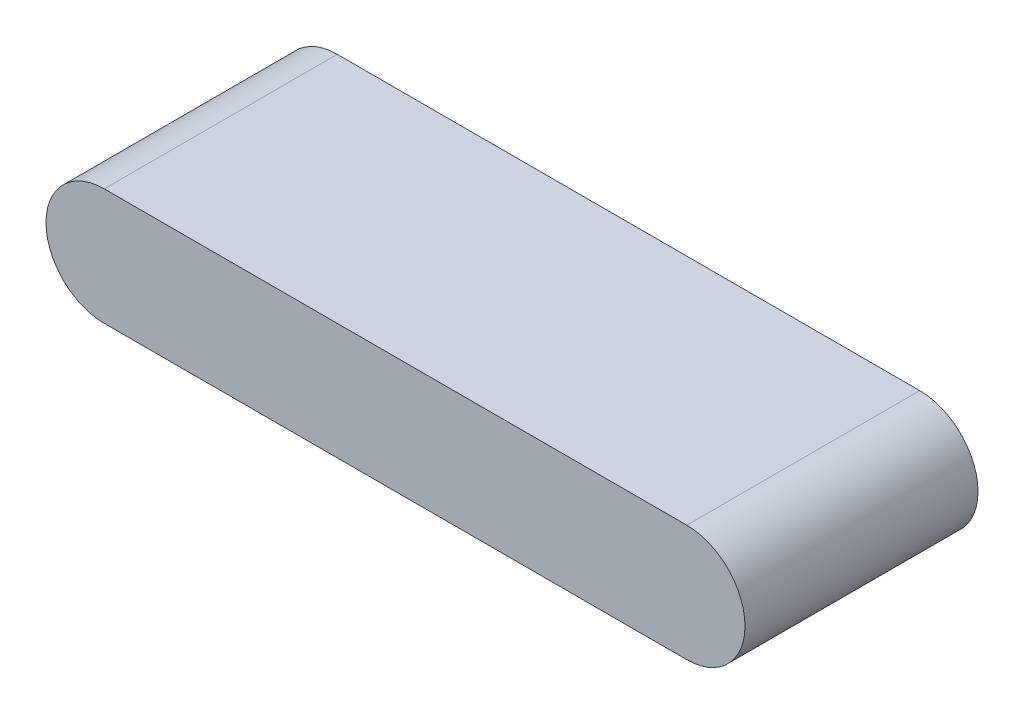
ISO-10303-21;
HEADER;
FILE_DESCRIPTION(('STEP AP214'),'2;1');
FILE_NAME('part.step','',(''),(''),'','','');
FILE_SCHEMA(('AUTOMOTIVE_DESIGN { 1 0 10303 214 1 1 1 1 }'));
ENDSEC;
DATA;
#1=APPLICATION_CONTEXT('core data for automotive mechanical design processes');
#2=APPLICATION_PROTOCOL_DEFINITION('international standard','automotive_design',2000,#1);
#3=PRODUCT_CONTEXT('',#1,'mechanical');
#4=PRODUCT('Part','Part','',(#3));
#5=PRODUCT_RELATED_PRODUCT_CATEGORY('part','',(#4));
#6=PRODUCT_DEFINITION_FORMATION('','',#4);
#7=PRODUCT_DEFINITION_CONTEXT('part definition',#1,'design');
#8=PRODUCT_DEFINITION('design','',#6,#7);
#9=PRODUCT_DEFINITION_SHAPE('','',#8);
#10=(LENGTH_UNIT() NAMED_UNIT(*) SI_UNIT(.MILLI.,.METRE.));
#11=(NAMED_UNIT(*) PLANE_ANGLE_UNIT() SI_UNIT($,.RADIAN.));
#12=(NAMED_UNIT(*) SI_UNIT($,.STERADIAN.) SOLID_ANGLE_UNIT());
#13=UNCERTAINTY_MEASURE_WITH_UNIT(LENGTH_MEASURE(1.E-05),#10,'distance_accuracy_value','');
#14=(GEOMETRIC_REPRESENTATION_CONTEXT(3) GLOBAL_UNCERTAINTY_ASSIGNED_CONTEXT((#13)) GLOBAL_UNIT_ASSIGNED_CONTEXT((#10,
#11,#12)) REPRESENTATION_CONTEXT('',''));
#15=CARTESIAN_POINT('',(0.,0.,0.));
#16=DIRECTION('',(0.,0.,1.));
#17=DIRECTION('',(1.,0.,0.));
#18=AXIS2_PLACEMENT_3D('',#15,#16,#17);
#19=CARTESIAN_POINT('',(-53.7983081875382,0.,25.4));
#20=DIRECTION('',(0.,0.,-1.));
#21=DIRECTION('',(-1.,0.,0.));
#22=AXIS2_PLACEMENT_3D('',#19,#20,#21);
#23=CYLINDRICAL_SURFACE('',#22,12.7);
#24=CARTESIAN_POINT('',(-53.7983081875382,0.,-25.4));
#25=DIRECTION('',(0.,0.,1.));
#26=DIRECTION('',(1.,0.,0.));
#27=AXIS2_PLACEMENT_3D('',#24,#25,#26);
#28=CIRCLE('',#27,12.7);
#29=CARTESIAN_POINT('',(-53.7983081875382,12.7,-25.4));
#30=VERTEX_POINT('',#29);
#31=CARTESIAN_POINT('',(-53.7983081875382,-12.7,-25.4));
#32=VERTEX_POINT('',#31);
#33=EDGE_CURVE('E97',#30,#32,#28,.T.);
#34=ORIENTED_EDGE('',*,*,#33,.T.);
#35=DIRECTION('',(0.,0.,-1.));
#36=VECTOR('',#35,1.);
#37=CARTESIAN_POINT('',(-53.7983081875382,-12.7,25.4));
#38=LINE('',#37,#36);
#39=CARTESIAN_POINT('',(-53.7983081875382,-12.7,25.4));
#40=VERTEX_POINT('',#39);
#41=EDGE_CURVE('E11',#40,#32,#38,.T.);
#42=ORIENTED_EDGE('',*,*,#41,.F.);
#43=CARTESIAN_POINT('',(-53.7983081875382,0.,25.4));
#44=DIRECTION('',(0.,0.,1.));
#45=DIRECTION('',(1.,0.,0.));
#46=AXIS2_PLACEMENT_3D('',#43,#44,#45);
#47=CIRCLE('',#46,12.7);
#48=CARTESIAN_POINT('',(-53.7983081875382,12.7,25.4));
#49=VERTEX_POINT('',#48);
#50=EDGE_CURVE('E85',#49,#40,#47,.T.);
#51=ORIENTED_EDGE('',*,*,#50,.F.);
#52=DIRECTION('',(0.,0.,-1.));
#53=VECTOR('',#52,1.);
#54=CARTESIAN_POINT('',(-53.7983081875382,12.7,25.4));
#55=LINE('',#54,#53);
#56=EDGE_CURVE('E93',#49,#30,#55,.T.);
#57=ORIENTED_EDGE('',*,*,#56,.T.);
#58=EDGE_LOOP('',(#34,#42,#51,#57));
#59=FACE_BOUND('',#58,.T.);
#60=ADVANCED_FACE('F34',(#59),#23,.T.);
#61=CARTESIAN_POINT('',(-53.7983081875382,-12.7,25.4));
#62=DIRECTION('',(0.,1.,0.));
#63=DIRECTION('',(0.,0.,1.));
#64=AXIS2_PLACEMENT_3D('',#61,#62,#63);
#65=PLANE('',#64);
#66=DIRECTION('',(1.,0.,0.));
#67=VECTOR('',#66,1.);
#68=CARTESIAN_POINT('',(-53.7983081875382,-12.7,-25.4));
#69=LINE('',#68,#67);
#70=CARTESIAN_POINT('',(73.2016918124618,-12.7,-25.4));
#71=VERTEX_POINT('',#70);
#72=EDGE_CURVE('E89',#32,#71,#69,.T.);
#73=ORIENTED_EDGE('',*,*,#72,.T.);
#74=DIRECTION('',(0.,0.,-1.));
#75=VECTOR('',#74,1.);
#76=CARTESIAN_POINT('',(73.2016918124618,-12.7,25.4));
#77=LINE('',#76,#75);
#78=CARTESIAN_POINT('',(73.2016918124618,-12.7,25.4));
#79=VERTEX_POINT('',#78);
#80=EDGE_CURVE('E42',#79,#71,#77,.T.);
#81=ORIENTED_EDGE('',*,*,#80,.F.);
#82=DIRECTION('',(1.,0.,0.));
#83=VECTOR('',#82,1.);
#84=CARTESIAN_POINT('',(-53.7983081875382,-12.7,25.4));
#85=LINE('',#84,#83);
#86=EDGE_CURVE('E80',#40,#79,#85,.T.);
#87=ORIENTED_EDGE('',*,*,#86,.F.);
#88=ORIENTED_EDGE('',*,*,#41,.T.);
#89=EDGE_LOOP('',(#73,#81,#87,#88));
#90=FACE_BOUND('',#89,.T.);
#91=ADVANCED_FACE('F88',(#90),#65,.F.);
#92=CARTESIAN_POINT('',(73.2016918124618,0.,25.4));
#93=DIRECTION('',(0.,0.,-1.));
#94=DIRECTION('',(-1.,0.,0.));
#95=AXIS2_PLACEMENT_3D('',#92,#93,#94);
#96=CYLINDRICAL_SURFACE('',#95,12.7);
#97=CARTESIAN_POINT('',(73.2016918124618,0.,-25.4));
#98=DIRECTION('',(0.,0.,1.));
#99=DIRECTION('',(1.,0.,0.));
#100=AXIS2_PLACEMENT_3D('',#97,#98,#99);
#101=CIRCLE('',#100,12.7);
#102=CARTESIAN_POINT('',(73.2016918124618,12.7,-25.4));
#103=VERTEX_POINT('',#102);
#104=EDGE_CURVE('E67',#71,#103,#101,.T.);
#105=ORIENTED_EDGE('',*,*,#104,.T.);
#106=DIRECTION('',(0.,0.,-1.));
#107=VECTOR('',#106,1.);
#108=CARTESIAN_POINT('',(73.2016918124618,12.7,25.4));
#109=LINE('',#108,#107);
#110=CARTESIAN_POINT('',(73.2016918124618,12.7,25.4));
#111=VERTEX_POINT('',#110);
#112=EDGE_CURVE('E90',#111,#103,#109,.T.);
#113=ORIENTED_EDGE('',*,*,#112,.F.);
#114=CARTESIAN_POINT('',(73.2016918124618,0.,25.4));
#115=DIRECTION('',(0.,0.,1.));
#116=DIRECTION('',(1.,0.,0.));
#117=AXIS2_PLACEMENT_3D('',#114,#115,#116);
#118=CIRCLE('',#117,12.7);
#119=EDGE_CURVE('E83',#79,#111,#118,.T.);
#120=ORIENTED_EDGE('',*,*,#119,.F.);
#121=ORIENTED_EDGE('',*,*,#80,.T.);
#122=EDGE_LOOP('',(#105,#113,#120,#121));
#123=FACE_BOUND('',#122,.T.);
#124=ADVANCED_FACE('F91',(#123),#96,.T.);
#125=CARTESIAN_POINT('',(-53.7983081875382,12.7,25.4));
#126=DIRECTION('',(0.,-1.,0.));
#127=DIRECTION('',(0.,0.,-1.));
#128=AXIS2_PLACEMENT_3D('',#125,#126,#127);
#129=PLANE('',#128);
#130=DIRECTION('',(-1.,0.,0.));
#131=VECTOR('',#130,1.);
#132=CARTESIAN_POINT('',(-53.7983081875382,12.7,-25.4));
#133=LINE('',#132,#131);
#134=EDGE_CURVE('E73',#103,#30,#133,.T.);
#135=ORIENTED_EDGE('',*,*,#134,.T.);
#136=ORIENTED_EDGE('',*,*,#56,.F.);
#137=DIRECTION('',(-1.,0.,0.));
#138=VECTOR('',#137,1.);
#139=CARTESIAN_POINT('',(-53.7983081875382,12.7,25.4));
#140=LINE('',#139,#138);
#141=EDGE_CURVE('E50',#111,#49,#140,.T.);
#142=ORIENTED_EDGE('',*,*,#141,.F.);
#143=ORIENTED_EDGE('',*,*,#112,.T.);
#144=EDGE_LOOP('',(#135,#136,#142,#143));
#145=FACE_BOUND('',#144,.T.);
#146=ADVANCED_FACE('F104',(#145),#129,.F.);
#147=CARTESIAN_POINT('',(-53.7983081875382,0.,25.4));
#148=DIRECTION('',(0.,0.,1.));
#149=DIRECTION('',(1.,0.,0.));
#150=AXIS2_PLACEMENT_3D('',#147,#148,#149);
#151=PLANE('',#150);
#152=ORIENTED_EDGE('',*,*,#50,.T.);
#153=ORIENTED_EDGE('',*,*,#86,.T.);
#154=ORIENTED_EDGE('',*,*,#119,.T.);
#155=ORIENTED_EDGE('',*,*,#141,.T.);
#156=EDGE_LOOP('',(#152,#153,#154,#155));
#157=FACE_BOUND('',#156,.T.);
#158=ADVANCED_FACE('F81',(#157),#151,.T.);
#159=CARTESIAN_POINT('',(-53.7983081875382,0.,-25.4));
#160=DIRECTION('',(0.,0.,1.));
#161=DIRECTION('',(1.,0.,0.));
#162=AXIS2_PLACEMENT_3D('',#159,#160,#161);
#163=PLANE('',#162);
#164=ORIENTED_EDGE('',*,*,#33,.F.);
#165=ORIENTED_EDGE('',*,*,#134,.F.);
#166=ORIENTED_EDGE('',*,*,#104,.F.);
#167=ORIENTED_EDGE('',*,*,#72,.F.);
#168=EDGE_LOOP('',(#164,#165,#166,#167));
#169=FACE_BOUND('',#168,.T.);
#170=ADVANCED_FACE('F107',(#169),#163,.F.);
#171=CLOSED_SHELL('',(#60,#91,#124,#146,#158,#170));
#172=MANIFOLD_SOLID_BREP('B2',#171);
#173=ADVANCED_BREP_SHAPE_REPRESENTATION('',(#18,#172),#14);
#174=SHAPE_DEFINITION_REPRESENTATION(#9,#173);
ENDSEC;
END-ISO-10303-21;
